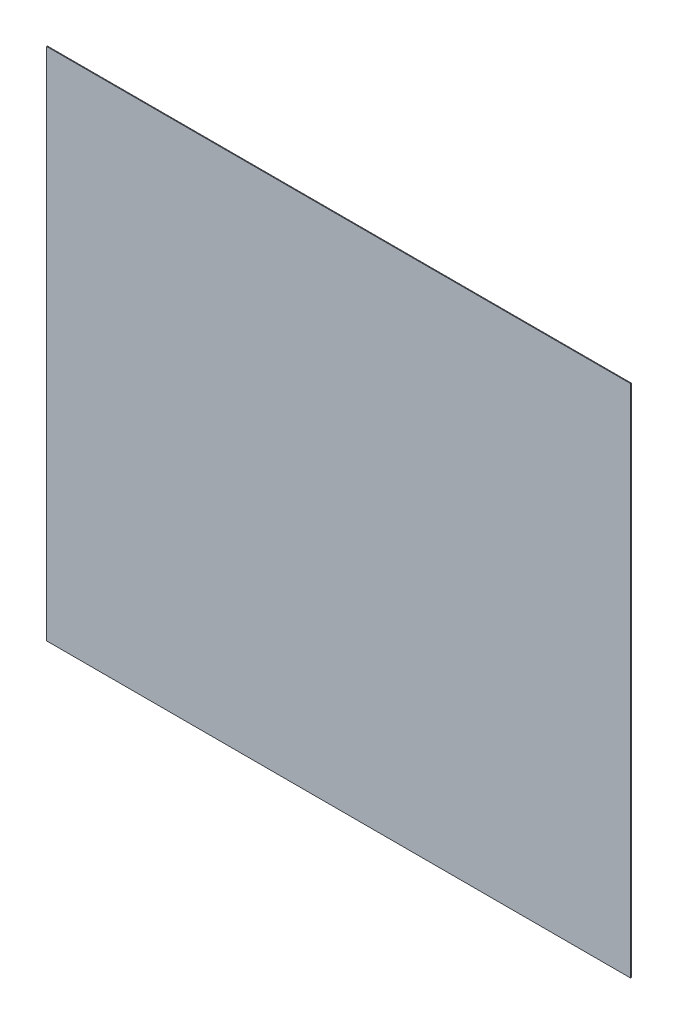
ISO-10303-21;
HEADER;
FILE_DESCRIPTION(('STEP AP214'),'2;1');
FILE_NAME('part.step','',(''),(''),'','','');
FILE_SCHEMA(('AUTOMOTIVE_DESIGN { 1 0 10303 214 1 1 1 1 }'));
ENDSEC;
DATA;
#1=APPLICATION_CONTEXT('core data for automotive mechanical design processes');
#2=APPLICATION_PROTOCOL_DEFINITION('international standard','automotive_design',2000,#1);
#3=PRODUCT_CONTEXT('',#1,'mechanical');
#4=PRODUCT('Part','Part','',(#3));
#5=PRODUCT_RELATED_PRODUCT_CATEGORY('part','',(#4));
#6=PRODUCT_DEFINITION_FORMATION('','',#4);
#7=PRODUCT_DEFINITION_CONTEXT('part definition',#1,'design');
#8=PRODUCT_DEFINITION('design','',#6,#7);
#9=PRODUCT_DEFINITION_SHAPE('','',#8);
#10=(LENGTH_UNIT() NAMED_UNIT(*) SI_UNIT(.MILLI.,.METRE.));
#11=(NAMED_UNIT(*) PLANE_ANGLE_UNIT() SI_UNIT($,.RADIAN.));
#12=(NAMED_UNIT(*) SI_UNIT($,.STERADIAN.) SOLID_ANGLE_UNIT());
#13=UNCERTAINTY_MEASURE_WITH_UNIT(LENGTH_MEASURE(1.E-05),#10,'distance_accuracy_value','');
#14=(GEOMETRIC_REPRESENTATION_CONTEXT(3) GLOBAL_UNCERTAINTY_ASSIGNED_CONTEXT((#13)) GLOBAL_UNIT_ASSIGNED_CONTEXT((#10,
#11,#12)) REPRESENTATION_CONTEXT('',''));
#15=CARTESIAN_POINT('',(0.,0.,0.));
#16=DIRECTION('',(0.,0.,1.));
#17=DIRECTION('',(1.,0.,0.));
#18=AXIS2_PLACEMENT_3D('',#15,#16,#17);
#19=CARTESIAN_POINT('',(-550.,485.,1.5));
#20=DIRECTION('',(1.,0.,0.));
#21=DIRECTION('',(0.,1.,0.));
#22=AXIS2_PLACEMENT_3D('',#19,#20,#21);
#23=PLANE('',#22);
#24=DIRECTION('',(0.,-1.,0.));
#25=VECTOR('',#24,1.);
#26=CARTESIAN_POINT('',(-550.,485.,0.));
#27=LINE('',#26,#25);
#28=CARTESIAN_POINT('',(-550.,485.,0.));
#29=VERTEX_POINT('',#28);
#30=CARTESIAN_POINT('',(-550.,-485.,0.));
#31=VERTEX_POINT('',#30);
#32=EDGE_CURVE('E98',#29,#31,#27,.T.);
#33=ORIENTED_EDGE('',*,*,#32,.T.);
#34=DIRECTION('',(0.,0.,-1.));
#35=VECTOR('',#34,1.);
#36=CARTESIAN_POINT('',(-550.,-485.,1.5));
#37=LINE('',#36,#35);
#38=CARTESIAN_POINT('',(-550.,-485.,1.5));
#39=VERTEX_POINT('',#38);
#40=EDGE_CURVE('E11',#39,#31,#37,.T.);
#41=ORIENTED_EDGE('',*,*,#40,.F.);
#42=DIRECTION('',(0.,-1.,0.));
#43=VECTOR('',#42,1.);
#44=CARTESIAN_POINT('',(-550.,485.,1.5));
#45=LINE('',#44,#43);
#46=CARTESIAN_POINT('',(-550.,485.,1.5));
#47=VERTEX_POINT('',#46);
#48=EDGE_CURVE('E86',#47,#39,#45,.T.);
#49=ORIENTED_EDGE('',*,*,#48,.F.);
#50=DIRECTION('',(0.,0.,-1.));
#51=VECTOR('',#50,1.);
#52=CARTESIAN_POINT('',(-550.,485.,1.5));
#53=LINE('',#52,#51);
#54=EDGE_CURVE('E94',#47,#29,#53,.T.);
#55=ORIENTED_EDGE('',*,*,#54,.T.);
#56=EDGE_LOOP('',(#33,#41,#49,#55));
#57=FACE_BOUND('',#56,.T.);
#58=ADVANCED_FACE('F35',(#57),#23,.F.);
#59=CARTESIAN_POINT('',(550.,-485.,1.5));
#60=DIRECTION('',(0.,1.,0.));
#61=DIRECTION('',(-1.,0.,0.));
#62=AXIS2_PLACEMENT_3D('',#59,#60,#61);
#63=PLANE('',#62);
#64=DIRECTION('',(1.,0.,0.));
#65=VECTOR('',#64,1.);
#66=CARTESIAN_POINT('',(550.,-485.,0.));
#67=LINE('',#66,#65);
#68=CARTESIAN_POINT('',(550.,-485.,0.));
#69=VERTEX_POINT('',#68);
#70=EDGE_CURVE('E90',#31,#69,#67,.T.);
#71=ORIENTED_EDGE('',*,*,#70,.T.);
#72=DIRECTION('',(0.,0.,-1.));
#73=VECTOR('',#72,1.);
#74=CARTESIAN_POINT('',(550.,-485.,1.5));
#75=LINE('',#74,#73);
#76=CARTESIAN_POINT('',(550.,-485.,1.5));
#77=VERTEX_POINT('',#76);
#78=EDGE_CURVE('E43',#77,#69,#75,.T.);
#79=ORIENTED_EDGE('',*,*,#78,.F.);
#80=DIRECTION('',(1.,0.,0.));
#81=VECTOR('',#80,1.);
#82=CARTESIAN_POINT('',(550.,-485.,1.5));
#83=LINE('',#82,#81);
#84=EDGE_CURVE('E81',#39,#77,#83,.T.);
#85=ORIENTED_EDGE('',*,*,#84,.F.);
#86=ORIENTED_EDGE('',*,*,#40,.T.);
#87=EDGE_LOOP('',(#71,#79,#85,#86));
#88=FACE_BOUND('',#87,.T.);
#89=ADVANCED_FACE('F89',(#88),#63,.F.);
#90=CARTESIAN_POINT('',(550.,485.,1.5));
#91=DIRECTION('',(-1.,0.,0.));
#92=DIRECTION('',(0.,-1.,0.));
#93=AXIS2_PLACEMENT_3D('',#90,#91,#92);
#94=PLANE('',#93);
#95=DIRECTION('',(0.,1.,0.));
#96=VECTOR('',#95,1.);
#97=CARTESIAN_POINT('',(550.,485.,0.));
#98=LINE('',#97,#96);
#99=CARTESIAN_POINT('',(550.,485.,0.));
#100=VERTEX_POINT('',#99);
#101=EDGE_CURVE('E68',#69,#100,#98,.T.);
#102=ORIENTED_EDGE('',*,*,#101,.T.);
#103=DIRECTION('',(0.,0.,-1.));
#104=VECTOR('',#103,1.);
#105=CARTESIAN_POINT('',(550.,485.,1.5));
#106=LINE('',#105,#104);
#107=CARTESIAN_POINT('',(550.,485.,1.5));
#108=VERTEX_POINT('',#107);
#109=EDGE_CURVE('E91',#108,#100,#106,.T.);
#110=ORIENTED_EDGE('',*,*,#109,.F.);
#111=DIRECTION('',(0.,1.,0.));
#112=VECTOR('',#111,1.);
#113=CARTESIAN_POINT('',(550.,485.,1.5));
#114=LINE('',#113,#112);
#115=EDGE_CURVE('E84',#77,#108,#114,.T.);
#116=ORIENTED_EDGE('',*,*,#115,.F.);
#117=ORIENTED_EDGE('',*,*,#78,.T.);
#118=EDGE_LOOP('',(#102,#110,#116,#117));
#119=FACE_BOUND('',#118,.T.);
#120=ADVANCED_FACE('F92',(#119),#94,.F.);
#121=CARTESIAN_POINT('',(550.,485.,1.5));
#122=DIRECTION('',(0.,-1.,0.));
#123=DIRECTION('',(1.,0.,0.));
#124=AXIS2_PLACEMENT_3D('',#121,#122,#123);
#125=PLANE('',#124);
#126=DIRECTION('',(-1.,0.,0.));
#127=VECTOR('',#126,1.);
#128=CARTESIAN_POINT('',(550.,485.,0.));
#129=LINE('',#128,#127);
#130=EDGE_CURVE('E74',#100,#29,#129,.T.);
#131=ORIENTED_EDGE('',*,*,#130,.T.);
#132=ORIENTED_EDGE('',*,*,#54,.F.);
#133=DIRECTION('',(-1.,0.,0.));
#134=VECTOR('',#133,1.);
#135=CARTESIAN_POINT('',(550.,485.,1.5));
#136=LINE('',#135,#134);
#137=EDGE_CURVE('E51',#108,#47,#136,.T.);
#138=ORIENTED_EDGE('',*,*,#137,.F.);
#139=ORIENTED_EDGE('',*,*,#109,.T.);
#140=EDGE_LOOP('',(#131,#132,#138,#139));
#141=FACE_BOUND('',#140,.T.);
#142=ADVANCED_FACE('F105',(#141),#125,.F.);
#143=CARTESIAN_POINT('',(0.,0.,1.5));
#144=DIRECTION('',(0.,0.,-1.));
#145=DIRECTION('',(-1.,0.,0.));
#146=AXIS2_PLACEMENT_3D('',#143,#144,#145);
#147=PLANE('',#146);
#148=ORIENTED_EDGE('',*,*,#48,.T.);
#149=ORIENTED_EDGE('',*,*,#84,.T.);
#150=ORIENTED_EDGE('',*,*,#115,.T.);
#151=ORIENTED_EDGE('',*,*,#137,.T.);
#152=EDGE_LOOP('',(#148,#149,#150,#151));
#153=FACE_BOUND('',#152,.T.);
#154=ADVANCED_FACE('F82',(#153),#147,.F.);
#155=CARTESIAN_POINT('',(0.,0.,0.));
#156=DIRECTION('',(0.,0.,-1.));
#157=DIRECTION('',(-1.,0.,0.));
#158=AXIS2_PLACEMENT_3D('',#155,#156,#157);
#159=PLANE('',#158);
#160=ORIENTED_EDGE('',*,*,#32,.F.);
#161=ORIENTED_EDGE('',*,*,#130,.F.);
#162=ORIENTED_EDGE('',*,*,#101,.F.);
#163=ORIENTED_EDGE('',*,*,#70,.F.);
#164=EDGE_LOOP('',(#160,#161,#162,#163));
#165=FACE_BOUND('',#164,.T.);
#166=ADVANCED_FACE('F108',(#165),#159,.T.);
#167=CLOSED_SHELL('',(#58,#89,#120,#142,#154,#166));
#168=MANIFOLD_SOLID_BREP('B2',#167);
#169=ADVANCED_BREP_SHAPE_REPRESENTATION('',(#18,#168),#14);
#170=SHAPE_DEFINITION_REPRESENTATION(#9,#169);
ENDSEC;
END-ISO-10303-21;
